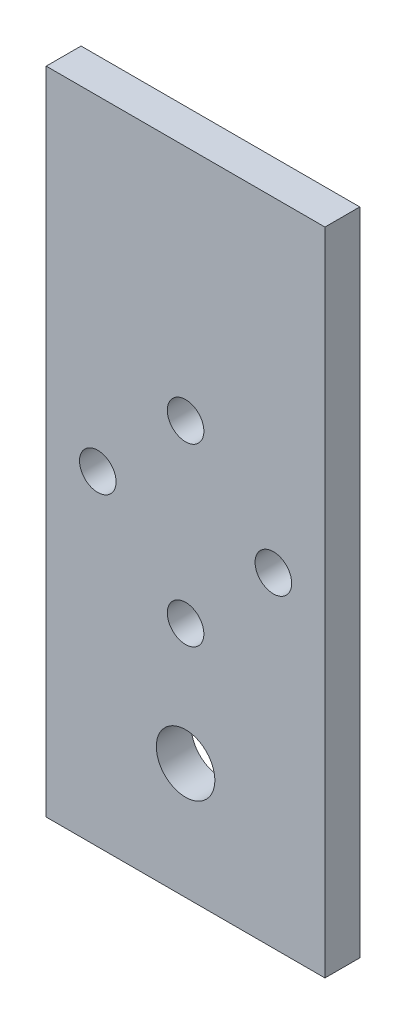
ISO-10303-21;
HEADER;
FILE_DESCRIPTION(('STEP AP214'),'2;1');
FILE_NAME('part.step','',(''),(''),'','','');
FILE_SCHEMA(('AUTOMOTIVE_DESIGN { 1 0 10303 214 1 1 1 1 }'));
ENDSEC;
DATA;
#1=APPLICATION_CONTEXT('core data for automotive mechanical design processes');
#2=APPLICATION_PROTOCOL_DEFINITION('international standard','automotive_design',2000,#1);
#3=PRODUCT_CONTEXT('',#1,'mechanical');
#4=PRODUCT('Part','Part','',(#3));
#5=PRODUCT_RELATED_PRODUCT_CATEGORY('part','',(#4));
#6=PRODUCT_DEFINITION_FORMATION('','',#4);
#7=PRODUCT_DEFINITION_CONTEXT('part definition',#1,'design');
#8=PRODUCT_DEFINITION('design','',#6,#7);
#9=PRODUCT_DEFINITION_SHAPE('','',#8);
#10=(LENGTH_UNIT() NAMED_UNIT(*) SI_UNIT(.MILLI.,.METRE.));
#11=(NAMED_UNIT(*) PLANE_ANGLE_UNIT() SI_UNIT($,.RADIAN.));
#12=(NAMED_UNIT(*) SI_UNIT($,.STERADIAN.) SOLID_ANGLE_UNIT());
#13=UNCERTAINTY_MEASURE_WITH_UNIT(LENGTH_MEASURE(1.E-05),#10,'distance_accuracy_value','');
#14=(GEOMETRIC_REPRESENTATION_CONTEXT(3) GLOBAL_UNCERTAINTY_ASSIGNED_CONTEXT((#13)) GLOBAL_UNIT_ASSIGNED_CONTEXT((#10,
#11,#12)) REPRESENTATION_CONTEXT('',''));
#15=CARTESIAN_POINT('',(0.,0.,0.));
#16=DIRECTION('',(0.,0.,1.));
#17=DIRECTION('',(1.,0.,0.));
#18=AXIS2_PLACEMENT_3D('',#15,#16,#17);
#19=CARTESIAN_POINT('',(0.,0.,4.7625));
#20=DIRECTION('',(0.,0.,-1.));
#21=DIRECTION('',(-1.,0.,0.));
#22=AXIS2_PLACEMENT_3D('',#19,#20,#21);
#23=PLANE('',#22);
#24=DIRECTION('',(0.,-1.,0.));
#25=VECTOR('',#24,1.);
#26=CARTESIAN_POINT('',(0.,0.,4.7625));
#27=LINE('',#26,#25);
#28=CARTESIAN_POINT('',(0.,88.9,4.7625));
#29=VERTEX_POINT('',#28);
#30=CARTESIAN_POINT('',(0.,0.,4.7625));
#31=VERTEX_POINT('',#30);
#32=EDGE_CURVE('E96',#29,#31,#27,.T.);
#33=ORIENTED_EDGE('',*,*,#32,.T.);
#34=DIRECTION('',(1.,0.,0.));
#35=VECTOR('',#34,1.);
#36=CARTESIAN_POINT('',(0.,0.,4.7625));
#37=LINE('',#36,#35);
#38=CARTESIAN_POINT('',(38.1,0.,4.7625));
#39=VERTEX_POINT('',#38);
#40=EDGE_CURVE('E91',#31,#39,#37,.T.);
#41=ORIENTED_EDGE('',*,*,#40,.T.);
#42=DIRECTION('',(0.,1.,0.));
#43=VECTOR('',#42,1.);
#44=CARTESIAN_POINT('',(38.1,0.,4.7625));
#45=LINE('',#44,#43);
#46=CARTESIAN_POINT('',(38.1,88.9,4.7625));
#47=VERTEX_POINT('',#46);
#48=EDGE_CURVE('E94',#39,#47,#45,.T.);
#49=ORIENTED_EDGE('',*,*,#48,.T.);
#50=DIRECTION('',(-1.,0.,0.));
#51=VECTOR('',#50,1.);
#52=CARTESIAN_POINT('',(0.,88.9,4.7625));
#53=LINE('',#52,#51);
#54=EDGE_CURVE('E61',#47,#29,#53,.T.);
#55=ORIENTED_EDGE('',*,*,#54,.T.);
#56=EDGE_LOOP('',(#33,#41,#49,#55));
#57=FACE_BOUND('',#56,.T.);
#58=CARTESIAN_POINT('',(19.05,56.45,4.7625));
#59=DIRECTION('',(0.,0.,1.));
#60=DIRECTION('',(1.,0.,0.));
#61=AXIS2_PLACEMENT_3D('',#58,#59,#60);
#62=CIRCLE('',#61,2.5);
#63=CARTESIAN_POINT('',(16.55,56.45,4.7625));
#64=VERTEX_POINT('',#63);
#65=EDGE_CURVE('E116',#64,#64,#62,.T.);
#66=ORIENTED_EDGE('',*,*,#65,.F.);
#67=EDGE_LOOP('',(#66));
#68=FACE_BOUND('',#67,.T.);
#69=CARTESIAN_POINT('',(31.05,44.45,4.7625));
#70=DIRECTION('',(0.,0.,1.));
#71=DIRECTION('',(1.,0.,0.));
#72=AXIS2_PLACEMENT_3D('',#69,#70,#71);
#73=CIRCLE('',#72,2.5);
#74=CARTESIAN_POINT('',(28.55,44.45,4.7625));
#75=VERTEX_POINT('',#74);
#76=EDGE_CURVE('E138',#75,#75,#73,.T.);
#77=ORIENTED_EDGE('',*,*,#76,.F.);
#78=EDGE_LOOP('',(#77));
#79=FACE_BOUND('',#78,.T.);
#80=CARTESIAN_POINT('',(19.05,32.45,4.7625));
#81=DIRECTION('',(0.,0.,1.));
#82=DIRECTION('',(1.,0.,0.));
#83=AXIS2_PLACEMENT_3D('',#80,#81,#82);
#84=CIRCLE('',#83,2.5);
#85=CARTESIAN_POINT('',(16.55,32.45,4.7625));
#86=VERTEX_POINT('',#85);
#87=EDGE_CURVE('E146',#86,#86,#84,.T.);
#88=ORIENTED_EDGE('',*,*,#87,.F.);
#89=EDGE_LOOP('',(#88));
#90=FACE_BOUND('',#89,.T.);
#91=CARTESIAN_POINT('',(7.05,44.45,4.7625));
#92=DIRECTION('',(0.,0.,1.));
#93=DIRECTION('',(1.,0.,0.));
#94=AXIS2_PLACEMENT_3D('',#91,#92,#93);
#95=CIRCLE('',#94,2.5);
#96=CARTESIAN_POINT('',(4.55,44.45,4.7625));
#97=VERTEX_POINT('',#96);
#98=EDGE_CURVE('E154',#97,#97,#95,.T.);
#99=ORIENTED_EDGE('',*,*,#98,.F.);
#100=EDGE_LOOP('',(#99));
#101=FACE_BOUND('',#100,.T.);
#102=CARTESIAN_POINT('',(19.05,15.875,4.7625));
#103=DIRECTION('',(0.,0.,1.));
#104=DIRECTION('',(1.,0.,0.));
#105=AXIS2_PLACEMENT_3D('',#102,#103,#104);
#106=CIRCLE('',#105,4.);
#107=CARTESIAN_POINT('',(15.05,15.875,4.7625));
#108=VERTEX_POINT('',#107);
#109=EDGE_CURVE('E162',#108,#108,#106,.T.);
#110=ORIENTED_EDGE('',*,*,#109,.F.);
#111=EDGE_LOOP('',(#110));
#112=FACE_BOUND('',#111,.T.);
#113=ADVANCED_FACE('F43',(#57,#68,#79,#90,#101,#112),#23,.F.);
#114=CARTESIAN_POINT('',(0.,0.,0.));
#115=DIRECTION('',(0.,0.,-1.));
#116=DIRECTION('',(-1.,0.,0.));
#117=AXIS2_PLACEMENT_3D('',#114,#115,#116);
#118=PLANE('',#117);
#119=CARTESIAN_POINT('',(7.05,44.45,0.));
#120=DIRECTION('',(0.,0.,1.));
#121=DIRECTION('',(1.,0.,0.));
#122=AXIS2_PLACEMENT_3D('',#119,#120,#121);
#123=CIRCLE('',#122,2.5);
#124=CARTESIAN_POINT('',(4.55,44.45,0.));
#125=VERTEX_POINT('',#124);
#126=EDGE_CURVE('E158',#125,#125,#123,.T.);
#127=ORIENTED_EDGE('',*,*,#126,.T.);
#128=EDGE_LOOP('',(#127));
#129=FACE_BOUND('',#128,.T.);
#130=CARTESIAN_POINT('',(31.05,44.45,0.));
#131=DIRECTION('',(0.,0.,1.));
#132=DIRECTION('',(1.,0.,0.));
#133=AXIS2_PLACEMENT_3D('',#130,#131,#132);
#134=CIRCLE('',#133,2.5);
#135=CARTESIAN_POINT('',(28.55,44.45,0.));
#136=VERTEX_POINT('',#135);
#137=EDGE_CURVE('E142',#136,#136,#134,.T.);
#138=ORIENTED_EDGE('',*,*,#137,.T.);
#139=EDGE_LOOP('',(#138));
#140=FACE_BOUND('',#139,.T.);
#141=DIRECTION('',(0.,-1.,0.));
#142=VECTOR('',#141,1.);
#143=CARTESIAN_POINT('',(0.,0.,0.));
#144=LINE('',#143,#142);
#145=CARTESIAN_POINT('',(0.,88.9,0.));
#146=VERTEX_POINT('',#145);
#147=CARTESIAN_POINT('',(0.,0.,0.));
#148=VERTEX_POINT('',#147);
#149=EDGE_CURVE('E112',#146,#148,#144,.T.);
#150=ORIENTED_EDGE('',*,*,#149,.F.);
#151=DIRECTION('',(-1.,0.,0.));
#152=VECTOR('',#151,1.);
#153=CARTESIAN_POINT('',(0.,88.9,0.));
#154=LINE('',#153,#152);
#155=CARTESIAN_POINT('',(38.1,88.9,0.));
#156=VERTEX_POINT('',#155);
#157=EDGE_CURVE('E84',#156,#146,#154,.T.);
#158=ORIENTED_EDGE('',*,*,#157,.F.);
#159=DIRECTION('',(0.,1.,0.));
#160=VECTOR('',#159,1.);
#161=CARTESIAN_POINT('',(38.1,0.,0.));
#162=LINE('',#161,#160);
#163=CARTESIAN_POINT('',(38.1,0.,0.));
#164=VERTEX_POINT('',#163);
#165=EDGE_CURVE('E78',#164,#156,#162,.T.);
#166=ORIENTED_EDGE('',*,*,#165,.F.);
#167=DIRECTION('',(1.,0.,0.));
#168=VECTOR('',#167,1.);
#169=CARTESIAN_POINT('',(0.,0.,0.));
#170=LINE('',#169,#168);
#171=EDGE_CURVE('E101',#148,#164,#170,.T.);
#172=ORIENTED_EDGE('',*,*,#171,.F.);
#173=EDGE_LOOP('',(#150,#158,#166,#172));
#174=FACE_BOUND('',#173,.T.);
#175=CARTESIAN_POINT('',(19.05,56.45,0.));
#176=DIRECTION('',(0.,0.,1.));
#177=DIRECTION('',(1.,0.,0.));
#178=AXIS2_PLACEMENT_3D('',#175,#176,#177);
#179=CIRCLE('',#178,2.5);
#180=CARTESIAN_POINT('',(16.55,56.45,0.));
#181=VERTEX_POINT('',#180);
#182=EDGE_CURVE('E134',#181,#181,#179,.T.);
#183=ORIENTED_EDGE('',*,*,#182,.T.);
#184=EDGE_LOOP('',(#183));
#185=FACE_BOUND('',#184,.T.);
#186=CARTESIAN_POINT('',(19.05,32.45,0.));
#187=DIRECTION('',(0.,0.,1.));
#188=DIRECTION('',(1.,0.,0.));
#189=AXIS2_PLACEMENT_3D('',#186,#187,#188);
#190=CIRCLE('',#189,2.5);
#191=CARTESIAN_POINT('',(16.55,32.45,0.));
#192=VERTEX_POINT('',#191);
#193=EDGE_CURVE('E150',#192,#192,#190,.T.);
#194=ORIENTED_EDGE('',*,*,#193,.T.);
#195=EDGE_LOOP('',(#194));
#196=FACE_BOUND('',#195,.T.);
#197=CARTESIAN_POINT('',(19.05,15.875,0.));
#198=DIRECTION('',(0.,0.,1.));
#199=DIRECTION('',(1.,0.,0.));
#200=AXIS2_PLACEMENT_3D('',#197,#198,#199);
#201=CIRCLE('',#200,4.);
#202=CARTESIAN_POINT('',(15.05,15.875,0.));
#203=VERTEX_POINT('',#202);
#204=EDGE_CURVE('E166',#203,#203,#201,.T.);
#205=ORIENTED_EDGE('',*,*,#204,.T.);
#206=EDGE_LOOP('',(#205));
#207=FACE_BOUND('',#206,.T.);
#208=ADVANCED_FACE('F129',(#129,#140,#174,#185,#196,#207),#118,.T.);
#209=CARTESIAN_POINT('',(0.,0.,4.7625));
#210=DIRECTION('',(1.,0.,0.));
#211=DIRECTION('',(0.,0.,-1.));
#212=AXIS2_PLACEMENT_3D('',#209,#210,#211);
#213=PLANE('',#212);
#214=ORIENTED_EDGE('',*,*,#149,.T.);
#215=DIRECTION('',(0.,0.,-1.));
#216=VECTOR('',#215,1.);
#217=CARTESIAN_POINT('',(0.,0.,4.7625));
#218=LINE('',#217,#216);
#219=EDGE_CURVE('E11',#31,#148,#218,.T.);
#220=ORIENTED_EDGE('',*,*,#219,.F.);
#221=ORIENTED_EDGE('',*,*,#32,.F.);
#222=DIRECTION('',(0.,0.,-1.));
#223=VECTOR('',#222,1.);
#224=CARTESIAN_POINT('',(0.,88.9,4.7625));
#225=LINE('',#224,#223);
#226=EDGE_CURVE('E108',#29,#146,#225,.T.);
#227=ORIENTED_EDGE('',*,*,#226,.T.);
#228=EDGE_LOOP('',(#214,#220,#221,#227));
#229=FACE_BOUND('',#228,.T.);
#230=ADVANCED_FACE('F45',(#229),#213,.F.);
#231=CARTESIAN_POINT('',(0.,0.,4.7625));
#232=DIRECTION('',(0.,1.,0.));
#233=DIRECTION('',(0.,0.,1.));
#234=AXIS2_PLACEMENT_3D('',#231,#232,#233);
#235=PLANE('',#234);
#236=ORIENTED_EDGE('',*,*,#171,.T.);
#237=DIRECTION('',(0.,0.,-1.));
#238=VECTOR('',#237,1.);
#239=CARTESIAN_POINT('',(38.1,0.,4.7625));
#240=LINE('',#239,#238);
#241=EDGE_CURVE('E53',#39,#164,#240,.T.);
#242=ORIENTED_EDGE('',*,*,#241,.F.);
#243=ORIENTED_EDGE('',*,*,#40,.F.);
#244=ORIENTED_EDGE('',*,*,#219,.T.);
#245=EDGE_LOOP('',(#236,#242,#243,#244));
#246=FACE_BOUND('',#245,.T.);
#247=ADVANCED_FACE('F100',(#246),#235,.F.);
#248=CARTESIAN_POINT('',(38.1,0.,4.7625));
#249=DIRECTION('',(-1.,0.,0.));
#250=DIRECTION('',(0.,0.,1.));
#251=AXIS2_PLACEMENT_3D('',#248,#249,#250);
#252=PLANE('',#251);
#253=ORIENTED_EDGE('',*,*,#165,.T.);
#254=DIRECTION('',(0.,0.,-1.));
#255=VECTOR('',#254,1.);
#256=CARTESIAN_POINT('',(38.1,88.9,4.7625));
#257=LINE('',#256,#255);
#258=EDGE_CURVE('E103',#47,#156,#257,.T.);
#259=ORIENTED_EDGE('',*,*,#258,.F.);
#260=ORIENTED_EDGE('',*,*,#48,.F.);
#261=ORIENTED_EDGE('',*,*,#241,.T.);
#262=EDGE_LOOP('',(#253,#259,#260,#261));
#263=FACE_BOUND('',#262,.T.);
#264=ADVANCED_FACE('F104',(#263),#252,.F.);
#265=CARTESIAN_POINT('',(0.,88.9,4.7625));
#266=DIRECTION('',(0.,-1.,0.));
#267=DIRECTION('',(0.,0.,-1.));
#268=AXIS2_PLACEMENT_3D('',#265,#266,#267);
#269=PLANE('',#268);
#270=ORIENTED_EDGE('',*,*,#157,.T.);
#271=ORIENTED_EDGE('',*,*,#226,.F.);
#272=ORIENTED_EDGE('',*,*,#54,.F.);
#273=ORIENTED_EDGE('',*,*,#258,.T.);
#274=EDGE_LOOP('',(#270,#271,#272,#273));
#275=FACE_BOUND('',#274,.T.);
#276=ADVANCED_FACE('F126',(#275),#269,.F.);
#277=CARTESIAN_POINT('',(19.05,56.45,4.7625));
#278=DIRECTION('',(0.,0.,-1.));
#279=DIRECTION('',(-1.,0.,0.));
#280=AXIS2_PLACEMENT_3D('',#277,#278,#279);
#281=CYLINDRICAL_SURFACE('',#280,2.5);
#282=CARTESIAN_POINT('',(16.55,56.45,4.7625));
#283=CARTESIAN_POINT('',(16.55,56.45,4.712890625));
#284=CARTESIAN_POINT('',(16.55,56.45,4.66328125));
#285=CARTESIAN_POINT('',(16.55,56.45,4.5640625));
#286=CARTESIAN_POINT('',(16.55,56.45,4.514453125));
#287=CARTESIAN_POINT('',(16.55,56.45,4.415234375));
#288=CARTESIAN_POINT('',(16.55,56.45,4.365625));
#289=CARTESIAN_POINT('',(16.55,56.45,4.26640625));
#290=CARTESIAN_POINT('',(16.55,56.45,4.216796875));
#291=CARTESIAN_POINT('',(16.55,56.45,4.117578125));
#292=CARTESIAN_POINT('',(16.55,56.45,4.06796875));
#293=CARTESIAN_POINT('',(16.55,56.45,3.96875));
#294=CARTESIAN_POINT('',(16.55,56.45,3.919140625));
#295=CARTESIAN_POINT('',(16.55,56.45,3.819921875));
#296=CARTESIAN_POINT('',(16.55,56.45,3.7703125));
#297=CARTESIAN_POINT('',(16.55,56.45,3.67109375));
#298=CARTESIAN_POINT('',(16.55,56.45,3.621484375));
#299=CARTESIAN_POINT('',(16.55,56.45,3.522265625));
#300=CARTESIAN_POINT('',(16.55,56.45,3.47265625));
#301=CARTESIAN_POINT('',(16.55,56.45,3.3734375));
#302=CARTESIAN_POINT('',(16.55,56.45,3.323828125));
#303=CARTESIAN_POINT('',(16.55,56.45,3.224609375));
#304=CARTESIAN_POINT('',(16.55,56.45,3.175));
#305=CARTESIAN_POINT('',(16.55,56.45,3.07578125));
#306=CARTESIAN_POINT('',(16.55,56.45,3.026171875));
#307=CARTESIAN_POINT('',(16.55,56.45,2.926953125));
#308=CARTESIAN_POINT('',(16.55,56.45,2.87734375));
#309=CARTESIAN_POINT('',(16.55,56.45,2.778125));
#310=CARTESIAN_POINT('',(16.55,56.45,2.728515625));
#311=CARTESIAN_POINT('',(16.55,56.45,2.629296875));
#312=CARTESIAN_POINT('',(16.55,56.45,2.5796875));
#313=CARTESIAN_POINT('',(16.55,56.45,2.48046875));
#314=CARTESIAN_POINT('',(16.55,56.45,2.430859375));
#315=CARTESIAN_POINT('',(16.55,56.45,2.331640625));
#316=CARTESIAN_POINT('',(16.55,56.45,2.28203125));
#317=CARTESIAN_POINT('',(16.55,56.45,2.1828125));
#318=CARTESIAN_POINT('',(16.55,56.45,2.133203125));
#319=CARTESIAN_POINT('',(16.55,56.45,2.033984375));
#320=CARTESIAN_POINT('',(16.55,56.45,1.984375));
#321=CARTESIAN_POINT('',(16.55,56.45,1.88515625));
#322=CARTESIAN_POINT('',(16.55,56.45,1.835546875));
#323=CARTESIAN_POINT('',(16.55,56.45,1.736328125));
#324=CARTESIAN_POINT('',(16.55,56.45,1.68671875));
#325=CARTESIAN_POINT('',(16.55,56.45,1.5875));
#326=CARTESIAN_POINT('',(16.55,56.45,1.537890625));
#327=CARTESIAN_POINT('',(16.55,56.45,1.438671875));
#328=CARTESIAN_POINT('',(16.55,56.45,1.3890625));
#329=CARTESIAN_POINT('',(16.55,56.45,1.28984375));
#330=CARTESIAN_POINT('',(16.55,56.45,1.240234375));
#331=CARTESIAN_POINT('',(16.55,56.45,1.141015625));
#332=CARTESIAN_POINT('',(16.55,56.45,1.09140625));
#333=CARTESIAN_POINT('',(16.55,56.45,0.992187499999999));
#334=CARTESIAN_POINT('',(16.55,56.45,0.942578124999999));
#335=CARTESIAN_POINT('',(16.55,56.45,0.843359375));
#336=CARTESIAN_POINT('',(16.55,56.45,0.79375));
#337=CARTESIAN_POINT('',(16.55,56.45,0.69453125));
#338=CARTESIAN_POINT('',(16.55,56.45,0.644921875));
#339=CARTESIAN_POINT('',(16.55,56.45,0.545703125));
#340=CARTESIAN_POINT('',(16.55,56.45,0.49609375));
#341=CARTESIAN_POINT('',(16.55,56.45,0.396875));
#342=CARTESIAN_POINT('',(16.55,56.45,0.347265625));
#343=CARTESIAN_POINT('',(16.55,56.45,0.248046875));
#344=CARTESIAN_POINT('',(16.55,56.45,0.1984375));
#345=CARTESIAN_POINT('',(16.55,56.45,0.09921875));
#346=CARTESIAN_POINT('',(16.55,56.45,0.049609375));
#347=CARTESIAN_POINT('',(16.55,56.45,0.));
#348=B_SPLINE_CURVE_WITH_KNOTS('',3,(#282,#283,#284,#285,#286,#287,#288,#289,#290,#291,#292,
#293,#294,#295,#296,#297,#298,#299,#300,#301,#302,#303,#304,#305,#306,#307,#308,#309,#310,#311,
#312,#313,#314,#315,#316,#317,#318,#319,#320,#321,#322,#323,#324,#325,#326,#327,#328,#329,#330,
#331,#332,#333,#334,#335,#336,#337,#338,#339,#340,#341,#342,#343,#344,#345,#346,#347),
.UNSPECIFIED.,.F.,.F.,(4,2,2,2,2,2,2,2,2,2,2,2,2,2,2,2,2,2,2,2,2,2,2,2,2,2,2,2,2,2,2,2,4),(0.,
0.148828125,0.29765625,0.446484375,0.5953125,0.744140625,0.892968750000001,1.041796875,1.190625,
1.339453125,1.48828125,1.637109375,1.7859375,1.934765625,2.08359375,2.232421875,2.38125,
2.530078125,2.67890625,2.827734375,2.9765625,3.125390625,3.27421875,3.423046875,3.571875,
3.720703125,3.86953125,4.018359375,4.1671875,4.316015625,4.46484375,4.613671875,4.7625),.UNSPECIFIED.);
#349=EDGE_CURVE('BSEAM185',#64,#181,#348,.T.);
#350=ORIENTED_EDGE('',*,*,#65,.T.);
#351=ORIENTED_EDGE('',*,*,#182,.F.);
#352=ORIENTED_EDGE('',*,*,#349,.T.);
#353=ORIENTED_EDGE('',*,*,#349,.F.);
#354=EDGE_LOOP('',(#350,#352,#351,#353));
#355=FACE_BOUND('',#354,.T.);
#356=ADVANCED_FACE('F185',(#355),#281,.F.);
#357=CARTESIAN_POINT('',(31.05,44.45,4.7625));
#358=DIRECTION('',(0.,0.,-1.));
#359=DIRECTION('',(-1.,0.,0.));
#360=AXIS2_PLACEMENT_3D('',#357,#358,#359);
#361=CYLINDRICAL_SURFACE('',#360,2.5);
#362=CARTESIAN_POINT('',(28.55,44.45,4.7625));
#363=CARTESIAN_POINT('',(28.55,44.45,4.712890625));
#364=CARTESIAN_POINT('',(28.55,44.45,4.66328125));
#365=CARTESIAN_POINT('',(28.55,44.45,4.5640625));
#366=CARTESIAN_POINT('',(28.55,44.45,4.514453125));
#367=CARTESIAN_POINT('',(28.55,44.45,4.415234375));
#368=CARTESIAN_POINT('',(28.55,44.45,4.365625));
#369=CARTESIAN_POINT('',(28.55,44.45,4.26640625));
#370=CARTESIAN_POINT('',(28.55,44.45,4.216796875));
#371=CARTESIAN_POINT('',(28.55,44.45,4.117578125));
#372=CARTESIAN_POINT('',(28.55,44.45,4.06796875));
#373=CARTESIAN_POINT('',(28.55,44.45,3.96875));
#374=CARTESIAN_POINT('',(28.55,44.45,3.919140625));
#375=CARTESIAN_POINT('',(28.55,44.45,3.819921875));
#376=CARTESIAN_POINT('',(28.55,44.45,3.7703125));
#377=CARTESIAN_POINT('',(28.55,44.45,3.67109375));
#378=CARTESIAN_POINT('',(28.55,44.45,3.621484375));
#379=CARTESIAN_POINT('',(28.55,44.45,3.522265625));
#380=CARTESIAN_POINT('',(28.55,44.45,3.47265625));
#381=CARTESIAN_POINT('',(28.55,44.45,3.3734375));
#382=CARTESIAN_POINT('',(28.55,44.45,3.323828125));
#383=CARTESIAN_POINT('',(28.55,44.45,3.224609375));
#384=CARTESIAN_POINT('',(28.55,44.45,3.175));
#385=CARTESIAN_POINT('',(28.55,44.45,3.07578125));
#386=CARTESIAN_POINT('',(28.55,44.45,3.026171875));
#387=CARTESIAN_POINT('',(28.55,44.45,2.926953125));
#388=CARTESIAN_POINT('',(28.55,44.45,2.87734375));
#389=CARTESIAN_POINT('',(28.55,44.45,2.778125));
#390=CARTESIAN_POINT('',(28.55,44.45,2.728515625));
#391=CARTESIAN_POINT('',(28.55,44.45,2.629296875));
#392=CARTESIAN_POINT('',(28.55,44.45,2.5796875));
#393=CARTESIAN_POINT('',(28.55,44.45,2.48046875));
#394=CARTESIAN_POINT('',(28.55,44.45,2.430859375));
#395=CARTESIAN_POINT('',(28.55,44.45,2.331640625));
#396=CARTESIAN_POINT('',(28.55,44.45,2.28203125));
#397=CARTESIAN_POINT('',(28.55,44.45,2.1828125));
#398=CARTESIAN_POINT('',(28.55,44.45,2.133203125));
#399=CARTESIAN_POINT('',(28.55,44.45,2.033984375));
#400=CARTESIAN_POINT('',(28.55,44.45,1.984375));
#401=CARTESIAN_POINT('',(28.55,44.45,1.88515625));
#402=CARTESIAN_POINT('',(28.55,44.45,1.835546875));
#403=CARTESIAN_POINT('',(28.55,44.45,1.736328125));
#404=CARTESIAN_POINT('',(28.55,44.45,1.68671875));
#405=CARTESIAN_POINT('',(28.55,44.45,1.5875));
#406=CARTESIAN_POINT('',(28.55,44.45,1.537890625));
#407=CARTESIAN_POINT('',(28.55,44.45,1.438671875));
#408=CARTESIAN_POINT('',(28.55,44.45,1.3890625));
#409=CARTESIAN_POINT('',(28.55,44.45,1.28984375));
#410=CARTESIAN_POINT('',(28.55,44.45,1.240234375));
#411=CARTESIAN_POINT('',(28.55,44.45,1.141015625));
#412=CARTESIAN_POINT('',(28.55,44.45,1.09140625));
#413=CARTESIAN_POINT('',(28.55,44.45,0.992187499999999));
#414=CARTESIAN_POINT('',(28.55,44.45,0.942578124999999));
#415=CARTESIAN_POINT('',(28.55,44.45,0.843359375));
#416=CARTESIAN_POINT('',(28.55,44.45,0.79375));
#417=CARTESIAN_POINT('',(28.55,44.45,0.69453125));
#418=CARTESIAN_POINT('',(28.55,44.45,0.644921875));
#419=CARTESIAN_POINT('',(28.55,44.45,0.545703125));
#420=CARTESIAN_POINT('',(28.55,44.45,0.49609375));
#421=CARTESIAN_POINT('',(28.55,44.45,0.396875));
#422=CARTESIAN_POINT('',(28.55,44.45,0.347265625));
#423=CARTESIAN_POINT('',(28.55,44.45,0.248046875));
#424=CARTESIAN_POINT('',(28.55,44.45,0.1984375));
#425=CARTESIAN_POINT('',(28.55,44.45,0.09921875));
#426=CARTESIAN_POINT('',(28.55,44.45,0.049609375));
#427=CARTESIAN_POINT('',(28.55,44.45,0.));
#428=B_SPLINE_CURVE_WITH_KNOTS('',3,(#362,#363,#364,#365,#366,#367,#368,#369,#370,#371,#372,
#373,#374,#375,#376,#377,#378,#379,#380,#381,#382,#383,#384,#385,#386,#387,#388,#389,#390,#391,
#392,#393,#394,#395,#396,#397,#398,#399,#400,#401,#402,#403,#404,#405,#406,#407,#408,#409,#410,
#411,#412,#413,#414,#415,#416,#417,#418,#419,#420,#421,#422,#423,#424,#425,#426,#427),
.UNSPECIFIED.,.F.,.F.,(4,2,2,2,2,2,2,2,2,2,2,2,2,2,2,2,2,2,2,2,2,2,2,2,2,2,2,2,2,2,2,2,4),(0.,
0.148828125,0.29765625,0.446484375,0.5953125,0.744140625,0.892968750000001,1.041796875,1.190625,
1.339453125,1.48828125,1.637109375,1.7859375,1.934765625,2.08359375,2.232421875,2.38125,
2.530078125,2.67890625,2.827734375,2.9765625,3.125390625,3.27421875,3.423046875,3.571875,
3.720703125,3.86953125,4.018359375,4.1671875,4.316015625,4.46484375,4.613671875,4.7625),.UNSPECIFIED.);
#429=EDGE_CURVE('BSEAM239',#75,#136,#428,.T.);
#430=ORIENTED_EDGE('',*,*,#76,.T.);
#431=ORIENTED_EDGE('',*,*,#137,.F.);
#432=ORIENTED_EDGE('',*,*,#429,.T.);
#433=ORIENTED_EDGE('',*,*,#429,.F.);
#434=EDGE_LOOP('',(#430,#432,#431,#433));
#435=FACE_BOUND('',#434,.T.);
#436=ADVANCED_FACE('F239',(#435),#361,.F.);
#437=CARTESIAN_POINT('',(19.05,32.45,4.7625));
#438=DIRECTION('',(0.,0.,-1.));
#439=DIRECTION('',(-1.,0.,0.));
#440=AXIS2_PLACEMENT_3D('',#437,#438,#439);
#441=CYLINDRICAL_SURFACE('',#440,2.5);
#442=CARTESIAN_POINT('',(16.55,32.45,4.7625));
#443=CARTESIAN_POINT('',(16.55,32.45,4.712890625));
#444=CARTESIAN_POINT('',(16.55,32.45,4.66328125));
#445=CARTESIAN_POINT('',(16.55,32.45,4.5640625));
#446=CARTESIAN_POINT('',(16.55,32.45,4.514453125));
#447=CARTESIAN_POINT('',(16.55,32.45,4.415234375));
#448=CARTESIAN_POINT('',(16.55,32.45,4.365625));
#449=CARTESIAN_POINT('',(16.55,32.45,4.26640625));
#450=CARTESIAN_POINT('',(16.55,32.45,4.216796875));
#451=CARTESIAN_POINT('',(16.55,32.45,4.117578125));
#452=CARTESIAN_POINT('',(16.55,32.45,4.06796875));
#453=CARTESIAN_POINT('',(16.55,32.45,3.96875));
#454=CARTESIAN_POINT('',(16.55,32.45,3.919140625));
#455=CARTESIAN_POINT('',(16.55,32.45,3.819921875));
#456=CARTESIAN_POINT('',(16.55,32.45,3.7703125));
#457=CARTESIAN_POINT('',(16.55,32.45,3.67109375));
#458=CARTESIAN_POINT('',(16.55,32.45,3.621484375));
#459=CARTESIAN_POINT('',(16.55,32.45,3.522265625));
#460=CARTESIAN_POINT('',(16.55,32.45,3.47265625));
#461=CARTESIAN_POINT('',(16.55,32.45,3.3734375));
#462=CARTESIAN_POINT('',(16.55,32.45,3.323828125));
#463=CARTESIAN_POINT('',(16.55,32.45,3.224609375));
#464=CARTESIAN_POINT('',(16.55,32.45,3.175));
#465=CARTESIAN_POINT('',(16.55,32.45,3.07578125));
#466=CARTESIAN_POINT('',(16.55,32.45,3.026171875));
#467=CARTESIAN_POINT('',(16.55,32.45,2.926953125));
#468=CARTESIAN_POINT('',(16.55,32.45,2.87734375));
#469=CARTESIAN_POINT('',(16.55,32.45,2.778125));
#470=CARTESIAN_POINT('',(16.55,32.45,2.728515625));
#471=CARTESIAN_POINT('',(16.55,32.45,2.629296875));
#472=CARTESIAN_POINT('',(16.55,32.45,2.5796875));
#473=CARTESIAN_POINT('',(16.55,32.45,2.48046875));
#474=CARTESIAN_POINT('',(16.55,32.45,2.430859375));
#475=CARTESIAN_POINT('',(16.55,32.45,2.331640625));
#476=CARTESIAN_POINT('',(16.55,32.45,2.28203125));
#477=CARTESIAN_POINT('',(16.55,32.45,2.1828125));
#478=CARTESIAN_POINT('',(16.55,32.45,2.133203125));
#479=CARTESIAN_POINT('',(16.55,32.45,2.033984375));
#480=CARTESIAN_POINT('',(16.55,32.45,1.984375));
#481=CARTESIAN_POINT('',(16.55,32.45,1.88515625));
#482=CARTESIAN_POINT('',(16.55,32.45,1.835546875));
#483=CARTESIAN_POINT('',(16.55,32.45,1.736328125));
#484=CARTESIAN_POINT('',(16.55,32.45,1.68671875));
#485=CARTESIAN_POINT('',(16.55,32.45,1.5875));
#486=CARTESIAN_POINT('',(16.55,32.45,1.537890625));
#487=CARTESIAN_POINT('',(16.55,32.45,1.438671875));
#488=CARTESIAN_POINT('',(16.55,32.45,1.3890625));
#489=CARTESIAN_POINT('',(16.55,32.45,1.28984375));
#490=CARTESIAN_POINT('',(16.55,32.45,1.240234375));
#491=CARTESIAN_POINT('',(16.55,32.45,1.141015625));
#492=CARTESIAN_POINT('',(16.55,32.45,1.09140625));
#493=CARTESIAN_POINT('',(16.55,32.45,0.992187499999999));
#494=CARTESIAN_POINT('',(16.55,32.45,0.942578124999999));
#495=CARTESIAN_POINT('',(16.55,32.45,0.843359375));
#496=CARTESIAN_POINT('',(16.55,32.45,0.79375));
#497=CARTESIAN_POINT('',(16.55,32.45,0.69453125));
#498=CARTESIAN_POINT('',(16.55,32.45,0.644921875));
#499=CARTESIAN_POINT('',(16.55,32.45,0.545703125));
#500=CARTESIAN_POINT('',(16.55,32.45,0.49609375));
#501=CARTESIAN_POINT('',(16.55,32.45,0.396875));
#502=CARTESIAN_POINT('',(16.55,32.45,0.347265625));
#503=CARTESIAN_POINT('',(16.55,32.45,0.248046875));
#504=CARTESIAN_POINT('',(16.55,32.45,0.1984375));
#505=CARTESIAN_POINT('',(16.55,32.45,0.09921875));
#506=CARTESIAN_POINT('',(16.55,32.45,0.049609375));
#507=CARTESIAN_POINT('',(16.55,32.45,0.));
#508=B_SPLINE_CURVE_WITH_KNOTS('',3,(#442,#443,#444,#445,#446,#447,#448,#449,#450,#451,#452,
#453,#454,#455,#456,#457,#458,#459,#460,#461,#462,#463,#464,#465,#466,#467,#468,#469,#470,#471,
#472,#473,#474,#475,#476,#477,#478,#479,#480,#481,#482,#483,#484,#485,#486,#487,#488,#489,#490,
#491,#492,#493,#494,#495,#496,#497,#498,#499,#500,#501,#502,#503,#504,#505,#506,#507),
.UNSPECIFIED.,.F.,.F.,(4,2,2,2,2,2,2,2,2,2,2,2,2,2,2,2,2,2,2,2,2,2,2,2,2,2,2,2,2,2,2,2,4),(0.,
0.148828125,0.29765625,0.446484375,0.5953125,0.744140625,0.892968750000001,1.041796875,1.190625,
1.339453125,1.48828125,1.637109375,1.7859375,1.934765625,2.08359375,2.232421875,2.38125,
2.530078125,2.67890625,2.827734375,2.9765625,3.125390625,3.27421875,3.423046875,3.571875,
3.720703125,3.86953125,4.018359375,4.1671875,4.316015625,4.46484375,4.613671875,4.7625),.UNSPECIFIED.);
#509=EDGE_CURVE('BSEAM248',#86,#192,#508,.T.);
#510=ORIENTED_EDGE('',*,*,#87,.T.);
#511=ORIENTED_EDGE('',*,*,#193,.F.);
#512=ORIENTED_EDGE('',*,*,#509,.T.);
#513=ORIENTED_EDGE('',*,*,#509,.F.);
#514=EDGE_LOOP('',(#510,#512,#511,#513));
#515=FACE_BOUND('',#514,.T.);
#516=ADVANCED_FACE('F248',(#515),#441,.F.);
#517=CARTESIAN_POINT('',(7.05,44.45,4.7625));
#518=DIRECTION('',(0.,0.,-1.));
#519=DIRECTION('',(-1.,0.,0.));
#520=AXIS2_PLACEMENT_3D('',#517,#518,#519);
#521=CYLINDRICAL_SURFACE('',#520,2.5);
#522=CARTESIAN_POINT('',(4.55,44.45,4.7625));
#523=CARTESIAN_POINT('',(4.55,44.45,4.712890625));
#524=CARTESIAN_POINT('',(4.55,44.45,4.66328125));
#525=CARTESIAN_POINT('',(4.55,44.45,4.5640625));
#526=CARTESIAN_POINT('',(4.55,44.45,4.514453125));
#527=CARTESIAN_POINT('',(4.55,44.45,4.415234375));
#528=CARTESIAN_POINT('',(4.55,44.45,4.365625));
#529=CARTESIAN_POINT('',(4.55,44.45,4.26640625));
#530=CARTESIAN_POINT('',(4.55,44.45,4.216796875));
#531=CARTESIAN_POINT('',(4.55,44.45,4.117578125));
#532=CARTESIAN_POINT('',(4.55,44.45,4.06796875));
#533=CARTESIAN_POINT('',(4.55,44.45,3.96875));
#534=CARTESIAN_POINT('',(4.55,44.45,3.919140625));
#535=CARTESIAN_POINT('',(4.55,44.45,3.819921875));
#536=CARTESIAN_POINT('',(4.55,44.45,3.7703125));
#537=CARTESIAN_POINT('',(4.55,44.45,3.67109375));
#538=CARTESIAN_POINT('',(4.55,44.45,3.621484375));
#539=CARTESIAN_POINT('',(4.55,44.45,3.522265625));
#540=CARTESIAN_POINT('',(4.55,44.45,3.47265625));
#541=CARTESIAN_POINT('',(4.55,44.45,3.3734375));
#542=CARTESIAN_POINT('',(4.55,44.45,3.323828125));
#543=CARTESIAN_POINT('',(4.55,44.45,3.224609375));
#544=CARTESIAN_POINT('',(4.55,44.45,3.175));
#545=CARTESIAN_POINT('',(4.55,44.45,3.07578125));
#546=CARTESIAN_POINT('',(4.55,44.45,3.026171875));
#547=CARTESIAN_POINT('',(4.55,44.45,2.926953125));
#548=CARTESIAN_POINT('',(4.55,44.45,2.87734375));
#549=CARTESIAN_POINT('',(4.55,44.45,2.778125));
#550=CARTESIAN_POINT('',(4.55,44.45,2.728515625));
#551=CARTESIAN_POINT('',(4.55,44.45,2.629296875));
#552=CARTESIAN_POINT('',(4.55,44.45,2.5796875));
#553=CARTESIAN_POINT('',(4.55,44.45,2.48046875));
#554=CARTESIAN_POINT('',(4.55,44.45,2.430859375));
#555=CARTESIAN_POINT('',(4.55,44.45,2.331640625));
#556=CARTESIAN_POINT('',(4.55,44.45,2.28203125));
#557=CARTESIAN_POINT('',(4.55,44.45,2.1828125));
#558=CARTESIAN_POINT('',(4.55,44.45,2.133203125));
#559=CARTESIAN_POINT('',(4.55,44.45,2.033984375));
#560=CARTESIAN_POINT('',(4.55,44.45,1.984375));
#561=CARTESIAN_POINT('',(4.55,44.45,1.88515625));
#562=CARTESIAN_POINT('',(4.55,44.45,1.835546875));
#563=CARTESIAN_POINT('',(4.55,44.45,1.736328125));
#564=CARTESIAN_POINT('',(4.55,44.45,1.68671875));
#565=CARTESIAN_POINT('',(4.55,44.45,1.5875));
#566=CARTESIAN_POINT('',(4.55,44.45,1.537890625));
#567=CARTESIAN_POINT('',(4.55,44.45,1.438671875));
#568=CARTESIAN_POINT('',(4.55,44.45,1.3890625));
#569=CARTESIAN_POINT('',(4.55,44.45,1.28984375));
#570=CARTESIAN_POINT('',(4.55,44.45,1.240234375));
#571=CARTESIAN_POINT('',(4.55,44.45,1.141015625));
#572=CARTESIAN_POINT('',(4.55,44.45,1.09140625));
#573=CARTESIAN_POINT('',(4.55,44.45,0.992187499999999));
#574=CARTESIAN_POINT('',(4.55,44.45,0.942578124999999));
#575=CARTESIAN_POINT('',(4.55,44.45,0.843359375));
#576=CARTESIAN_POINT('',(4.55,44.45,0.79375));
#577=CARTESIAN_POINT('',(4.55,44.45,0.69453125));
#578=CARTESIAN_POINT('',(4.55,44.45,0.644921875));
#579=CARTESIAN_POINT('',(4.55,44.45,0.545703125));
#580=CARTESIAN_POINT('',(4.55,44.45,0.49609375));
#581=CARTESIAN_POINT('',(4.55,44.45,0.396875));
#582=CARTESIAN_POINT('',(4.55,44.45,0.347265625));
#583=CARTESIAN_POINT('',(4.55,44.45,0.248046875));
#584=CARTESIAN_POINT('',(4.55,44.45,0.1984375));
#585=CARTESIAN_POINT('',(4.55,44.45,0.09921875));
#586=CARTESIAN_POINT('',(4.55,44.45,0.049609375));
#587=CARTESIAN_POINT('',(4.55,44.45,0.));
#588=B_SPLINE_CURVE_WITH_KNOTS('',3,(#522,#523,#524,#525,#526,#527,#528,#529,#530,#531,#532,
#533,#534,#535,#536,#537,#538,#539,#540,#541,#542,#543,#544,#545,#546,#547,#548,#549,#550,#551,
#552,#553,#554,#555,#556,#557,#558,#559,#560,#561,#562,#563,#564,#565,#566,#567,#568,#569,#570,
#571,#572,#573,#574,#575,#576,#577,#578,#579,#580,#581,#582,#583,#584,#585,#586,#587),
.UNSPECIFIED.,.F.,.F.,(4,2,2,2,2,2,2,2,2,2,2,2,2,2,2,2,2,2,2,2,2,2,2,2,2,2,2,2,2,2,2,2,4),(0.,
0.148828125,0.29765625,0.446484375,0.5953125,0.744140625,0.892968750000001,1.041796875,1.190625,
1.339453125,1.48828125,1.637109375,1.7859375,1.934765625,2.08359375,2.232421875,2.38125,
2.530078125,2.67890625,2.827734375,2.9765625,3.125390625,3.27421875,3.423046875,3.571875,
3.720703125,3.86953125,4.018359375,4.1671875,4.316015625,4.46484375,4.613671875,4.7625),.UNSPECIFIED.);
#589=EDGE_CURVE('BSEAM257',#97,#125,#588,.T.);
#590=ORIENTED_EDGE('',*,*,#98,.T.);
#591=ORIENTED_EDGE('',*,*,#126,.F.);
#592=ORIENTED_EDGE('',*,*,#589,.T.);
#593=ORIENTED_EDGE('',*,*,#589,.F.);
#594=EDGE_LOOP('',(#590,#592,#591,#593));
#595=FACE_BOUND('',#594,.T.);
#596=ADVANCED_FACE('F257',(#595),#521,.F.);
#597=CARTESIAN_POINT('',(19.05,15.875,4.7625));
#598=DIRECTION('',(0.,0.,-1.));
#599=DIRECTION('',(-1.,0.,0.));
#600=AXIS2_PLACEMENT_3D('',#597,#598,#599);
#601=CYLINDRICAL_SURFACE('',#600,4.);
#602=CARTESIAN_POINT('',(15.05,15.875,4.7625));
#603=CARTESIAN_POINT('',(15.05,15.875,4.712890625));
#604=CARTESIAN_POINT('',(15.05,15.875,4.66328125));
#605=CARTESIAN_POINT('',(15.05,15.875,4.5640625));
#606=CARTESIAN_POINT('',(15.05,15.875,4.514453125));
#607=CARTESIAN_POINT('',(15.05,15.875,4.415234375));
#608=CARTESIAN_POINT('',(15.05,15.875,4.365625));
#609=CARTESIAN_POINT('',(15.05,15.875,4.26640625));
#610=CARTESIAN_POINT('',(15.05,15.875,4.216796875));
#611=CARTESIAN_POINT('',(15.05,15.875,4.117578125));
#612=CARTESIAN_POINT('',(15.05,15.875,4.06796875));
#613=CARTESIAN_POINT('',(15.05,15.875,3.96875));
#614=CARTESIAN_POINT('',(15.05,15.875,3.919140625));
#615=CARTESIAN_POINT('',(15.05,15.875,3.819921875));
#616=CARTESIAN_POINT('',(15.05,15.875,3.7703125));
#617=CARTESIAN_POINT('',(15.05,15.875,3.67109375));
#618=CARTESIAN_POINT('',(15.05,15.875,3.621484375));
#619=CARTESIAN_POINT('',(15.05,15.875,3.522265625));
#620=CARTESIAN_POINT('',(15.05,15.875,3.47265625));
#621=CARTESIAN_POINT('',(15.05,15.875,3.3734375));
#622=CARTESIAN_POINT('',(15.05,15.875,3.323828125));
#623=CARTESIAN_POINT('',(15.05,15.875,3.224609375));
#624=CARTESIAN_POINT('',(15.05,15.875,3.175));
#625=CARTESIAN_POINT('',(15.05,15.875,3.07578125));
#626=CARTESIAN_POINT('',(15.05,15.875,3.026171875));
#627=CARTESIAN_POINT('',(15.05,15.875,2.926953125));
#628=CARTESIAN_POINT('',(15.05,15.875,2.87734375));
#629=CARTESIAN_POINT('',(15.05,15.875,2.778125));
#630=CARTESIAN_POINT('',(15.05,15.875,2.728515625));
#631=CARTESIAN_POINT('',(15.05,15.875,2.629296875));
#632=CARTESIAN_POINT('',(15.05,15.875,2.5796875));
#633=CARTESIAN_POINT('',(15.05,15.875,2.48046875));
#634=CARTESIAN_POINT('',(15.05,15.875,2.430859375));
#635=CARTESIAN_POINT('',(15.05,15.875,2.331640625));
#636=CARTESIAN_POINT('',(15.05,15.875,2.28203125));
#637=CARTESIAN_POINT('',(15.05,15.875,2.1828125));
#638=CARTESIAN_POINT('',(15.05,15.875,2.133203125));
#639=CARTESIAN_POINT('',(15.05,15.875,2.033984375));
#640=CARTESIAN_POINT('',(15.05,15.875,1.984375));
#641=CARTESIAN_POINT('',(15.05,15.875,1.88515625));
#642=CARTESIAN_POINT('',(15.05,15.875,1.835546875));
#643=CARTESIAN_POINT('',(15.05,15.875,1.736328125));
#644=CARTESIAN_POINT('',(15.05,15.875,1.68671875));
#645=CARTESIAN_POINT('',(15.05,15.875,1.5875));
#646=CARTESIAN_POINT('',(15.05,15.875,1.537890625));
#647=CARTESIAN_POINT('',(15.05,15.875,1.438671875));
#648=CARTESIAN_POINT('',(15.05,15.875,1.3890625));
#649=CARTESIAN_POINT('',(15.05,15.875,1.28984375));
#650=CARTESIAN_POINT('',(15.05,15.875,1.240234375));
#651=CARTESIAN_POINT('',(15.05,15.875,1.141015625));
#652=CARTESIAN_POINT('',(15.05,15.875,1.09140625));
#653=CARTESIAN_POINT('',(15.05,15.875,0.992187499999999));
#654=CARTESIAN_POINT('',(15.05,15.875,0.942578124999999));
#655=CARTESIAN_POINT('',(15.05,15.875,0.843359375));
#656=CARTESIAN_POINT('',(15.05,15.875,0.79375));
#657=CARTESIAN_POINT('',(15.05,15.875,0.69453125));
#658=CARTESIAN_POINT('',(15.05,15.875,0.644921875));
#659=CARTESIAN_POINT('',(15.05,15.875,0.545703125));
#660=CARTESIAN_POINT('',(15.05,15.875,0.49609375));
#661=CARTESIAN_POINT('',(15.05,15.875,0.396875));
#662=CARTESIAN_POINT('',(15.05,15.875,0.347265625));
#663=CARTESIAN_POINT('',(15.05,15.875,0.248046875));
#664=CARTESIAN_POINT('',(15.05,15.875,0.1984375));
#665=CARTESIAN_POINT('',(15.05,15.875,0.09921875));
#666=CARTESIAN_POINT('',(15.05,15.875,0.049609375));
#667=CARTESIAN_POINT('',(15.05,15.875,0.));
#668=B_SPLINE_CURVE_WITH_KNOTS('',3,(#602,#603,#604,#605,#606,#607,#608,#609,#610,#611,#612,
#613,#614,#615,#616,#617,#618,#619,#620,#621,#622,#623,#624,#625,#626,#627,#628,#629,#630,#631,
#632,#633,#634,#635,#636,#637,#638,#639,#640,#641,#642,#643,#644,#645,#646,#647,#648,#649,#650,
#651,#652,#653,#654,#655,#656,#657,#658,#659,#660,#661,#662,#663,#664,#665,#666,#667),
.UNSPECIFIED.,.F.,.F.,(4,2,2,2,2,2,2,2,2,2,2,2,2,2,2,2,2,2,2,2,2,2,2,2,2,2,2,2,2,2,2,2,4),(0.,
0.148828125,0.29765625,0.446484375,0.5953125,0.744140625,0.892968750000001,1.041796875,1.190625,
1.339453125,1.48828125,1.637109375,1.7859375,1.934765625,2.08359375,2.232421875,2.38125,
2.530078125,2.67890625,2.827734375,2.9765625,3.125390625,3.27421875,3.423046875,3.571875,
3.720703125,3.86953125,4.018359375,4.1671875,4.316015625,4.46484375,4.613671875,4.7625),.UNSPECIFIED.);
#669=EDGE_CURVE('BSEAM174',#108,#203,#668,.T.);
#670=ORIENTED_EDGE('',*,*,#109,.T.);
#671=ORIENTED_EDGE('',*,*,#204,.F.);
#672=ORIENTED_EDGE('',*,*,#669,.T.);
#673=ORIENTED_EDGE('',*,*,#669,.F.);
#674=EDGE_LOOP('',(#670,#672,#671,#673));
#675=FACE_BOUND('',#674,.T.);
#676=ADVANCED_FACE('F174',(#675),#601,.F.);
#677=CLOSED_SHELL('',(#113,#208,#230,#247,#264,#276,#356,#436,#516,#596,#676));
#678=MANIFOLD_SOLID_BREP('B2',#677);
#679=ADVANCED_BREP_SHAPE_REPRESENTATION('',(#18,#678),#14);
#680=SHAPE_DEFINITION_REPRESENTATION(#9,#679);
ENDSEC;
END-ISO-10303-21;
